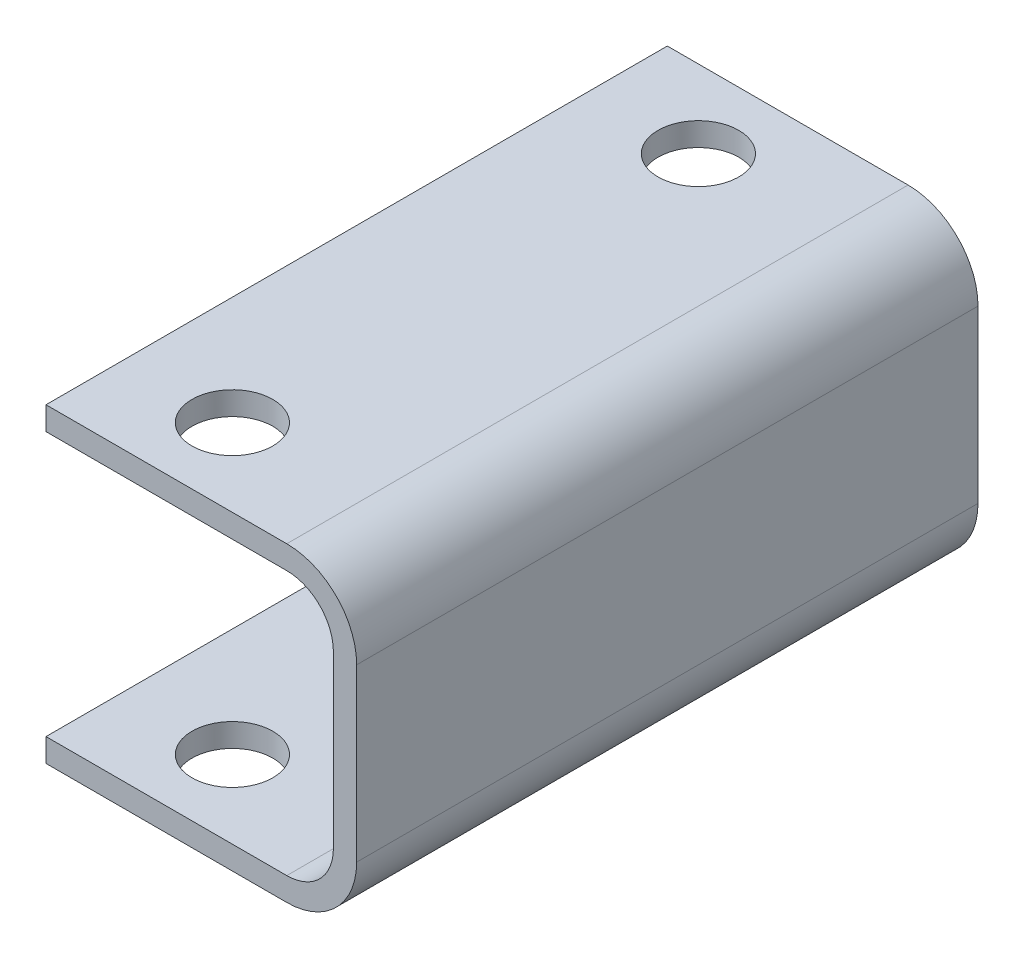
ISO-10303-21;
HEADER;
FILE_DESCRIPTION(('STEP AP214'),'2;1');
FILE_NAME('part.step','',(''),(''),'','','');
FILE_SCHEMA(('AUTOMOTIVE_DESIGN { 1 0 10303 214 1 1 1 1 }'));
ENDSEC;
DATA;
#1=APPLICATION_CONTEXT('core data for automotive mechanical design processes');
#2=APPLICATION_PROTOCOL_DEFINITION('international standard','automotive_design',2000,#1);
#3=PRODUCT_CONTEXT('',#1,'mechanical');
#4=PRODUCT('Part','Part','',(#3));
#5=PRODUCT_RELATED_PRODUCT_CATEGORY('part','',(#4));
#6=PRODUCT_DEFINITION_FORMATION('','',#4);
#7=PRODUCT_DEFINITION_CONTEXT('part definition',#1,'design');
#8=PRODUCT_DEFINITION('design','',#6,#7);
#9=PRODUCT_DEFINITION_SHAPE('','',#8);
#10=(LENGTH_UNIT() NAMED_UNIT(*) SI_UNIT(.MILLI.,.METRE.));
#11=(NAMED_UNIT(*) PLANE_ANGLE_UNIT() SI_UNIT($,.RADIAN.));
#12=(NAMED_UNIT(*) SI_UNIT($,.STERADIAN.) SOLID_ANGLE_UNIT());
#13=UNCERTAINTY_MEASURE_WITH_UNIT(LENGTH_MEASURE(1.E-05),#10,'distance_accuracy_value','');
#14=(GEOMETRIC_REPRESENTATION_CONTEXT(3) GLOBAL_UNCERTAINTY_ASSIGNED_CONTEXT((#13)) GLOBAL_UNIT_ASSIGNED_CONTEXT((#10,
#11,#12)) REPRESENTATION_CONTEXT('',''));
#15=CARTESIAN_POINT('',(0.,0.,0.));
#16=DIRECTION('',(0.,0.,1.));
#17=DIRECTION('',(1.,0.,0.));
#18=AXIS2_PLACEMENT_3D('',#15,#16,#17);
#19=CARTESIAN_POINT('',(0.925677431688005,5.5,40.));
#20=DIRECTION('',(0.,0.,-1.));
#21=DIRECTION('',(-1.,0.,0.));
#22=AXIS2_PLACEMENT_3D('',#19,#20,#21);
#23=CYLINDRICAL_SURFACE('',#22,3.);
#24=CARTESIAN_POINT('',(0.925677431688005,5.5,0.));
#25=DIRECTION('',(0.,0.,-1.));
#26=DIRECTION('',(-1.,0.,0.));
#27=AXIS2_PLACEMENT_3D('',#24,#25,#26);
#28=CIRCLE('',#27,3.);
#29=CARTESIAN_POINT('',(0.925677431687984,8.5,0.));
#30=VERTEX_POINT('',#29);
#31=CARTESIAN_POINT('',(3.92567743168801,5.49999999999998,0.));
#32=VERTEX_POINT('',#31);
#33=EDGE_CURVE('E167',#30,#32,#28,.T.);
#34=ORIENTED_EDGE('',*,*,#33,.T.);
#35=DIRECTION('',(0.,0.,-1.));
#36=VECTOR('',#35,1.);
#37=CARTESIAN_POINT('',(3.92567743168801,5.49999999999998,40.));
#38=LINE('',#37,#36);
#39=CARTESIAN_POINT('',(3.92567743168801,5.49999999999998,40.));
#40=VERTEX_POINT('',#39);
#41=EDGE_CURVE('E11',#40,#32,#38,.T.);
#42=ORIENTED_EDGE('',*,*,#41,.F.);
#43=CARTESIAN_POINT('',(0.925677431688005,5.5,40.));
#44=DIRECTION('',(0.,0.,-1.));
#45=DIRECTION('',(-1.,0.,0.));
#46=AXIS2_PLACEMENT_3D('',#43,#44,#45);
#47=CIRCLE('',#46,3.);
#48=CARTESIAN_POINT('',(0.925677431687984,8.5,40.));
#49=VERTEX_POINT('',#48);
#50=EDGE_CURVE('E190',#49,#40,#47,.T.);
#51=ORIENTED_EDGE('',*,*,#50,.F.);
#52=DIRECTION('',(0.,0.,-1.));
#53=VECTOR('',#52,1.);
#54=CARTESIAN_POINT('',(0.925677431687984,8.5,40.));
#55=LINE('',#54,#53);
#56=EDGE_CURVE('E163',#49,#30,#55,.T.);
#57=ORIENTED_EDGE('',*,*,#56,.T.);
#58=EDGE_LOOP('',(#34,#42,#51,#57));
#59=FACE_BOUND('',#58,.T.);
#60=ADVANCED_FACE('F45',(#59),#23,.F.);
#61=CARTESIAN_POINT('',(3.92567743168801,-5.49999999999998,40.));
#62=DIRECTION('',(1.,0.,0.));
#63=DIRECTION('',(0.,0.,-1.));
#64=AXIS2_PLACEMENT_3D('',#61,#62,#63);
#65=PLANE('',#64);
#66=DIRECTION('',(0.,-1.,0.));
#67=VECTOR('',#66,1.);
#68=CARTESIAN_POINT('',(3.92567743168801,-5.49999999999998,0.));
#69=LINE('',#68,#67);
#70=CARTESIAN_POINT('',(3.92567743168801,-5.49999999999998,0.));
#71=VERTEX_POINT('',#70);
#72=EDGE_CURVE('E170',#32,#71,#69,.T.);
#73=ORIENTED_EDGE('',*,*,#72,.T.);
#74=DIRECTION('',(0.,0.,-1.));
#75=VECTOR('',#74,1.);
#76=CARTESIAN_POINT('',(3.92567743168801,-5.49999999999998,40.));
#77=LINE('',#76,#75);
#78=CARTESIAN_POINT('',(3.92567743168801,-5.49999999999998,40.));
#79=VERTEX_POINT('',#78);
#80=EDGE_CURVE('E54',#79,#71,#77,.T.);
#81=ORIENTED_EDGE('',*,*,#80,.F.);
#82=DIRECTION('',(0.,-1.,0.));
#83=VECTOR('',#82,1.);
#84=CARTESIAN_POINT('',(3.92567743168801,-5.49999999999998,40.));
#85=LINE('',#84,#83);
#86=EDGE_CURVE('E118',#40,#79,#85,.T.);
#87=ORIENTED_EDGE('',*,*,#86,.F.);
#88=ORIENTED_EDGE('',*,*,#41,.T.);
#89=EDGE_LOOP('',(#73,#81,#87,#88));
#90=FACE_BOUND('',#89,.T.);
#91=ADVANCED_FACE('F282',(#90),#65,.F.);
#92=CARTESIAN_POINT('',(0.925677431688005,-5.5,40.));
#93=DIRECTION('',(0.,0.,-1.));
#94=DIRECTION('',(-1.,0.,0.));
#95=AXIS2_PLACEMENT_3D('',#92,#93,#94);
#96=CYLINDRICAL_SURFACE('',#95,3.);
#97=CARTESIAN_POINT('',(0.925677431688005,-5.5,0.));
#98=DIRECTION('',(0.,0.,-1.));
#99=DIRECTION('',(1.,0.,0.));
#100=AXIS2_PLACEMENT_3D('',#97,#98,#99);
#101=CIRCLE('',#100,3.);
#102=CARTESIAN_POINT('',(0.925677431687984,-8.5,0.));
#103=VERTEX_POINT('',#102);
#104=EDGE_CURVE('E173',#71,#103,#101,.T.);
#105=ORIENTED_EDGE('',*,*,#104,.T.);
#106=DIRECTION('',(0.,0.,-1.));
#107=VECTOR('',#106,1.);
#108=CARTESIAN_POINT('',(0.925677431687984,-8.5,40.));
#109=LINE('',#108,#107);
#110=CARTESIAN_POINT('',(0.925677431687984,-8.5,40.));
#111=VERTEX_POINT('',#110);
#112=EDGE_CURVE('E209',#111,#103,#109,.T.);
#113=ORIENTED_EDGE('',*,*,#112,.F.);
#114=CARTESIAN_POINT('',(0.925677431688005,-5.5,40.));
#115=DIRECTION('',(0.,0.,-1.));
#116=DIRECTION('',(1.,0.,0.));
#117=AXIS2_PLACEMENT_3D('',#114,#115,#116);
#118=CIRCLE('',#117,3.);
#119=EDGE_CURVE('E239',#79,#111,#118,.T.);
#120=ORIENTED_EDGE('',*,*,#119,.F.);
#121=ORIENTED_EDGE('',*,*,#80,.T.);
#122=EDGE_LOOP('',(#105,#113,#120,#121));
#123=FACE_BOUND('',#122,.T.);
#124=ADVANCED_FACE('F286',(#123),#96,.F.);
#125=CARTESIAN_POINT('',(-14.574322568312,-8.5,40.));
#126=DIRECTION('',(0.,-1.,0.));
#127=DIRECTION('',(1.,0.,0.));
#128=AXIS2_PLACEMENT_3D('',#125,#126,#127);
#129=PLANE('',#128);
#130=CARTESIAN_POINT('',(-7.574322568312,-8.5,35.));
#131=DIRECTION('',(0.,-1.,0.));
#132=DIRECTION('',(1.,0.,0.));
#133=AXIS2_PLACEMENT_3D('',#130,#131,#132);
#134=CIRCLE('',#133,2.59999999999999);
#135=CARTESIAN_POINT('',(-4.974322568312,-8.5,35.));
#136=VERTEX_POINT('',#135);
#137=EDGE_CURVE('E171',#136,#136,#134,.T.);
#138=ORIENTED_EDGE('',*,*,#137,.T.);
#139=EDGE_LOOP('',(#138));
#140=FACE_BOUND('',#139,.T.);
#141=CARTESIAN_POINT('',(-7.57432256831199,-8.5,5.));
#142=DIRECTION('',(0.,-1.,0.));
#143=DIRECTION('',(1.,0.,0.));
#144=AXIS2_PLACEMENT_3D('',#141,#142,#143);
#145=CIRCLE('',#144,2.6);
#146=CARTESIAN_POINT('',(-4.97432256831199,-8.5,5.));
#147=VERTEX_POINT('',#146);
#148=EDGE_CURVE('E215',#147,#147,#145,.T.);
#149=ORIENTED_EDGE('',*,*,#148,.T.);
#150=EDGE_LOOP('',(#149));
#151=FACE_BOUND('',#150,.T.);
#152=DIRECTION('',(-1.,0.,0.));
#153=VECTOR('',#152,1.);
#154=CARTESIAN_POINT('',(-14.574322568312,-8.5,0.));
#155=LINE('',#154,#153);
#156=CARTESIAN_POINT('',(-14.574322568312,-8.5,0.));
#157=VERTEX_POINT('',#156);
#158=EDGE_CURVE('E175',#103,#157,#155,.T.);
#159=ORIENTED_EDGE('',*,*,#158,.T.);
#160=DIRECTION('',(0.,0.,-1.));
#161=VECTOR('',#160,1.);
#162=CARTESIAN_POINT('',(-14.574322568312,-8.5,40.));
#163=LINE('',#162,#161);
#164=CARTESIAN_POINT('',(-14.574322568312,-8.5,40.));
#165=VERTEX_POINT('',#164);
#166=EDGE_CURVE('E206',#165,#157,#163,.T.);
#167=ORIENTED_EDGE('',*,*,#166,.F.);
#168=DIRECTION('',(-1.,0.,0.));
#169=VECTOR('',#168,1.);
#170=CARTESIAN_POINT('',(-14.574322568312,-8.5,40.));
#171=LINE('',#170,#169);
#172=EDGE_CURVE('E241',#111,#165,#171,.T.);
#173=ORIENTED_EDGE('',*,*,#172,.F.);
#174=ORIENTED_EDGE('',*,*,#112,.T.);
#175=EDGE_LOOP('',(#159,#167,#173,#174));
#176=FACE_BOUND('',#175,.T.);
#177=ADVANCED_FACE('F290',(#140,#151,#176),#129,.F.);
#178=CARTESIAN_POINT('',(-14.574322568312,-10.,40.));
#179=DIRECTION('',(1.,0.,0.));
#180=DIRECTION('',(0.,1.,0.));
#181=AXIS2_PLACEMENT_3D('',#178,#179,#180);
#182=PLANE('',#181);
#183=DIRECTION('',(0.,-1.,0.));
#184=VECTOR('',#183,1.);
#185=CARTESIAN_POINT('',(-14.574322568312,-10.,0.));
#186=LINE('',#185,#184);
#187=CARTESIAN_POINT('',(-14.574322568312,-10.,0.));
#188=VERTEX_POINT('',#187);
#189=EDGE_CURVE('E177',#157,#188,#186,.T.);
#190=ORIENTED_EDGE('',*,*,#189,.T.);
#191=DIRECTION('',(0.,0.,-1.));
#192=VECTOR('',#191,1.);
#193=CARTESIAN_POINT('',(-14.574322568312,-10.,40.));
#194=LINE('',#193,#192);
#195=CARTESIAN_POINT('',(-14.574322568312,-10.,40.));
#196=VERTEX_POINT('',#195);
#197=EDGE_CURVE('E203',#196,#188,#194,.T.);
#198=ORIENTED_EDGE('',*,*,#197,.F.);
#199=DIRECTION('',(0.,-1.,0.));
#200=VECTOR('',#199,1.);
#201=CARTESIAN_POINT('',(-14.574322568312,-10.,40.));
#202=LINE('',#201,#200);
#203=EDGE_CURVE('E243',#165,#196,#202,.T.);
#204=ORIENTED_EDGE('',*,*,#203,.F.);
#205=ORIENTED_EDGE('',*,*,#166,.T.);
#206=EDGE_LOOP('',(#190,#198,#204,#205));
#207=FACE_BOUND('',#206,.T.);
#208=ADVANCED_FACE('F296',(#207),#182,.F.);
#209=CARTESIAN_POINT('',(0.925677431687973,-10.,40.));
#210=DIRECTION('',(0.,1.,0.));
#211=DIRECTION('',(0.,0.,1.));
#212=AXIS2_PLACEMENT_3D('',#209,#210,#211);
#213=PLANE('',#212);
#214=CARTESIAN_POINT('',(-7.574322568312,-10.,35.));
#215=DIRECTION('',(0.,-1.,0.));
#216=DIRECTION('',(0.,0.,-1.));
#217=AXIS2_PLACEMENT_3D('',#214,#215,#216);
#218=CIRCLE('',#217,2.59999999999999);
#219=CARTESIAN_POINT('',(-7.574322568312,-10.,32.4));
#220=VERTEX_POINT('',#219);
#221=EDGE_CURVE('E222',#220,#220,#218,.T.);
#222=ORIENTED_EDGE('',*,*,#221,.F.);
#223=EDGE_LOOP('',(#222));
#224=FACE_BOUND('',#223,.T.);
#225=CARTESIAN_POINT('',(-7.57432256831199,-10.,5.));
#226=DIRECTION('',(0.,-1.,0.));
#227=DIRECTION('',(0.,0.,-1.));
#228=AXIS2_PLACEMENT_3D('',#225,#226,#227);
#229=CIRCLE('',#228,2.6);
#230=CARTESIAN_POINT('',(-7.57432256831199,-10.,2.4));
#231=VERTEX_POINT('',#230);
#232=EDGE_CURVE('E227',#231,#231,#229,.T.);
#233=ORIENTED_EDGE('',*,*,#232,.F.);
#234=EDGE_LOOP('',(#233));
#235=FACE_BOUND('',#234,.T.);
#236=DIRECTION('',(1.,0.,0.));
#237=VECTOR('',#236,1.);
#238=CARTESIAN_POINT('',(0.925677431687973,-10.,0.));
#239=LINE('',#238,#237);
#240=CARTESIAN_POINT('',(0.925677431687973,-10.,0.));
#241=VERTEX_POINT('',#240);
#242=EDGE_CURVE('E179',#188,#241,#239,.T.);
#243=ORIENTED_EDGE('',*,*,#242,.T.);
#244=DIRECTION('',(0.,0.,-1.));
#245=VECTOR('',#244,1.);
#246=CARTESIAN_POINT('',(0.925677431687973,-10.,40.));
#247=LINE('',#246,#245);
#248=CARTESIAN_POINT('',(0.925677431687973,-10.,40.));
#249=VERTEX_POINT('',#248);
#250=EDGE_CURVE('E200',#249,#241,#247,.T.);
#251=ORIENTED_EDGE('',*,*,#250,.F.);
#252=DIRECTION('',(1.,0.,0.));
#253=VECTOR('',#252,1.);
#254=CARTESIAN_POINT('',(0.925677431687973,-10.,40.));
#255=LINE('',#254,#253);
#256=EDGE_CURVE('E245',#196,#249,#255,.T.);
#257=ORIENTED_EDGE('',*,*,#256,.F.);
#258=ORIENTED_EDGE('',*,*,#197,.T.);
#259=EDGE_LOOP('',(#243,#251,#257,#258));
#260=FACE_BOUND('',#259,.T.);
#261=ADVANCED_FACE('F300',(#224,#235,#260),#213,.F.);
#262=CARTESIAN_POINT('',(0.925677431688006,-5.5,40.));
#263=DIRECTION('',(0.,0.,-1.));
#264=DIRECTION('',(-1.,0.,0.));
#265=AXIS2_PLACEMENT_3D('',#262,#263,#264);
#266=CYLINDRICAL_SURFACE('',#265,4.5);
#267=CARTESIAN_POINT('',(0.925677431688006,-5.5,0.));
#268=DIRECTION('',(0.,0.,1.));
#269=DIRECTION('',(-1.,0.,0.));
#270=AXIS2_PLACEMENT_3D('',#267,#268,#269);
#271=CIRCLE('',#270,4.5);
#272=CARTESIAN_POINT('',(5.425677431688,-5.49999999999997,0.));
#273=VERTEX_POINT('',#272);
#274=EDGE_CURVE('E181',#241,#273,#271,.T.);
#275=ORIENTED_EDGE('',*,*,#274,.T.);
#276=DIRECTION('',(0.,0.,-1.));
#277=VECTOR('',#276,1.);
#278=CARTESIAN_POINT('',(5.425677431688,-5.49999999999997,40.));
#279=LINE('',#278,#277);
#280=CARTESIAN_POINT('',(5.425677431688,-5.49999999999997,40.));
#281=VERTEX_POINT('',#280);
#282=EDGE_CURVE('E197',#281,#273,#279,.T.);
#283=ORIENTED_EDGE('',*,*,#282,.F.);
#284=CARTESIAN_POINT('',(0.925677431688006,-5.5,40.));
#285=DIRECTION('',(0.,0.,1.));
#286=DIRECTION('',(-1.,0.,0.));
#287=AXIS2_PLACEMENT_3D('',#284,#285,#286);
#288=CIRCLE('',#287,4.5);
#289=EDGE_CURVE('E247',#249,#281,#288,.T.);
#290=ORIENTED_EDGE('',*,*,#289,.F.);
#291=ORIENTED_EDGE('',*,*,#250,.T.);
#292=EDGE_LOOP('',(#275,#283,#290,#291));
#293=FACE_BOUND('',#292,.T.);
#294=ADVANCED_FACE('F304',(#293),#266,.T.);
#295=CARTESIAN_POINT('',(5.425677431688,5.49999999999997,40.));
#296=DIRECTION('',(-1.,0.,0.));
#297=DIRECTION('',(0.,0.,1.));
#298=AXIS2_PLACEMENT_3D('',#295,#296,#297);
#299=PLANE('',#298);
#300=DIRECTION('',(0.,1.,0.));
#301=VECTOR('',#300,1.);
#302=CARTESIAN_POINT('',(5.425677431688,5.49999999999997,0.));
#303=LINE('',#302,#301);
#304=CARTESIAN_POINT('',(5.425677431688,5.49999999999997,0.));
#305=VERTEX_POINT('',#304);
#306=EDGE_CURVE('E183',#273,#305,#303,.T.);
#307=ORIENTED_EDGE('',*,*,#306,.T.);
#308=DIRECTION('',(0.,0.,-1.));
#309=VECTOR('',#308,1.);
#310=CARTESIAN_POINT('',(5.425677431688,5.49999999999997,40.));
#311=LINE('',#310,#309);
#312=CARTESIAN_POINT('',(5.425677431688,5.49999999999997,40.));
#313=VERTEX_POINT('',#312);
#314=EDGE_CURVE('E194',#313,#305,#311,.T.);
#315=ORIENTED_EDGE('',*,*,#314,.F.);
#316=DIRECTION('',(0.,1.,0.));
#317=VECTOR('',#316,1.);
#318=CARTESIAN_POINT('',(5.425677431688,5.49999999999997,40.));
#319=LINE('',#318,#317);
#320=EDGE_CURVE('E249',#281,#313,#319,.T.);
#321=ORIENTED_EDGE('',*,*,#320,.F.);
#322=ORIENTED_EDGE('',*,*,#282,.T.);
#323=EDGE_LOOP('',(#307,#315,#321,#322));
#324=FACE_BOUND('',#323,.T.);
#325=ADVANCED_FACE('F255',(#324),#299,.F.);
#326=CARTESIAN_POINT('',(0.925677431688005,5.5,40.));
#327=DIRECTION('',(0.,0.,-1.));
#328=DIRECTION('',(-1.,0.,0.));
#329=AXIS2_PLACEMENT_3D('',#326,#327,#328);
#330=CYLINDRICAL_SURFACE('',#329,4.5);
#331=CARTESIAN_POINT('',(0.925677431688005,5.5,0.));
#332=DIRECTION('',(0.,0.,1.));
#333=DIRECTION('',(1.,0.,0.));
#334=AXIS2_PLACEMENT_3D('',#331,#332,#333);
#335=CIRCLE('',#334,4.5);
#336=CARTESIAN_POINT('',(0.925677431687974,10.,0.));
#337=VERTEX_POINT('',#336);
#338=EDGE_CURVE('E185',#305,#337,#335,.T.);
#339=ORIENTED_EDGE('',*,*,#338,.T.);
#340=DIRECTION('',(0.,0.,-1.));
#341=VECTOR('',#340,1.);
#342=CARTESIAN_POINT('',(0.925677431687974,10.,40.));
#343=LINE('',#342,#341);
#344=CARTESIAN_POINT('',(0.925677431687974,10.,40.));
#345=VERTEX_POINT('',#344);
#346=EDGE_CURVE('E158',#345,#337,#343,.T.);
#347=ORIENTED_EDGE('',*,*,#346,.F.);
#348=CARTESIAN_POINT('',(0.925677431688005,5.5,40.));
#349=DIRECTION('',(0.,0.,1.));
#350=DIRECTION('',(1.,0.,0.));
#351=AXIS2_PLACEMENT_3D('',#348,#349,#350);
#352=CIRCLE('',#351,4.5);
#353=EDGE_CURVE('E149',#313,#345,#352,.T.);
#354=ORIENTED_EDGE('',*,*,#353,.F.);
#355=ORIENTED_EDGE('',*,*,#314,.T.);
#356=EDGE_LOOP('',(#339,#347,#354,#355));
#357=FACE_BOUND('',#356,.T.);
#358=ADVANCED_FACE('F259',(#357),#330,.T.);
#359=CARTESIAN_POINT('',(0.925677431687973,10.,40.));
#360=DIRECTION('',(0.,-1.,0.));
#361=DIRECTION('',(0.,0.,-1.));
#362=AXIS2_PLACEMENT_3D('',#359,#360,#361);
#363=PLANE('',#362);
#364=CARTESIAN_POINT('',(-7.574322568312,10.,35.));
#365=DIRECTION('',(0.,-1.,0.));
#366=DIRECTION('',(0.,0.,-1.));
#367=AXIS2_PLACEMENT_3D('',#364,#365,#366);
#368=CIRCLE('',#367,2.59999999999999);
#369=CARTESIAN_POINT('',(-7.574322568312,10.,32.4));
#370=VERTEX_POINT('',#369);
#371=EDGE_CURVE('E216',#370,#370,#368,.F.);
#372=ORIENTED_EDGE('',*,*,#371,.F.);
#373=EDGE_LOOP('',(#372));
#374=FACE_BOUND('',#373,.T.);
#375=CARTESIAN_POINT('',(-7.57432256831199,10.,5.));
#376=DIRECTION('',(0.,-1.,0.));
#377=DIRECTION('',(0.,0.,-1.));
#378=AXIS2_PLACEMENT_3D('',#375,#376,#377);
#379=CIRCLE('',#378,2.6);
#380=CARTESIAN_POINT('',(-7.57432256831199,10.,2.4));
#381=VERTEX_POINT('',#380);
#382=EDGE_CURVE('E230',#381,#381,#379,.F.);
#383=ORIENTED_EDGE('',*,*,#382,.F.);
#384=EDGE_LOOP('',(#383));
#385=FACE_BOUND('',#384,.T.);
#386=DIRECTION('',(-1.,0.,0.));
#387=VECTOR('',#386,1.);
#388=CARTESIAN_POINT('',(0.925677431687973,10.,0.));
#389=LINE('',#388,#387);
#390=CARTESIAN_POINT('',(-14.574322568312,10.,0.));
#391=VERTEX_POINT('',#390);
#392=EDGE_CURVE('E157',#337,#391,#389,.T.);
#393=ORIENTED_EDGE('',*,*,#392,.T.);
#394=DIRECTION('',(0.,0.,-1.));
#395=VECTOR('',#394,1.);
#396=CARTESIAN_POINT('',(-14.574322568312,10.,40.));
#397=LINE('',#396,#395);
#398=CARTESIAN_POINT('',(-14.574322568312,10.,40.));
#399=VERTEX_POINT('',#398);
#400=EDGE_CURVE('E154',#399,#391,#397,.T.);
#401=ORIENTED_EDGE('',*,*,#400,.F.);
#402=DIRECTION('',(-1.,0.,0.));
#403=VECTOR('',#402,1.);
#404=CARTESIAN_POINT('',(0.925677431687973,10.,40.));
#405=LINE('',#404,#403);
#406=EDGE_CURVE('E143',#345,#399,#405,.T.);
#407=ORIENTED_EDGE('',*,*,#406,.F.);
#408=ORIENTED_EDGE('',*,*,#346,.T.);
#409=EDGE_LOOP('',(#393,#401,#407,#408));
#410=FACE_BOUND('',#409,.T.);
#411=ADVANCED_FACE('F155',(#374,#385,#410),#363,.F.);
#412=CARTESIAN_POINT('',(-14.574322568312,10.,40.));
#413=DIRECTION('',(1.,0.,0.));
#414=DIRECTION('',(0.,1.,0.));
#415=AXIS2_PLACEMENT_3D('',#412,#413,#414);
#416=PLANE('',#415);
#417=DIRECTION('',(0.,-1.,0.));
#418=VECTOR('',#417,1.);
#419=CARTESIAN_POINT('',(-14.574322568312,10.,0.));
#420=LINE('',#419,#418);
#421=CARTESIAN_POINT('',(-14.574322568312,8.5,0.));
#422=VERTEX_POINT('',#421);
#423=EDGE_CURVE('E104',#391,#422,#420,.T.);
#424=ORIENTED_EDGE('',*,*,#423,.T.);
#425=DIRECTION('',(0.,0.,-1.));
#426=VECTOR('',#425,1.);
#427=CARTESIAN_POINT('',(-14.574322568312,8.5,40.));
#428=LINE('',#427,#426);
#429=CARTESIAN_POINT('',(-14.574322568312,8.5,40.));
#430=VERTEX_POINT('',#429);
#431=EDGE_CURVE('E159',#430,#422,#428,.T.);
#432=ORIENTED_EDGE('',*,*,#431,.F.);
#433=DIRECTION('',(0.,-1.,0.));
#434=VECTOR('',#433,1.);
#435=CARTESIAN_POINT('',(-14.574322568312,10.,40.));
#436=LINE('',#435,#434);
#437=EDGE_CURVE('E147',#399,#430,#436,.T.);
#438=ORIENTED_EDGE('',*,*,#437,.F.);
#439=ORIENTED_EDGE('',*,*,#400,.T.);
#440=EDGE_LOOP('',(#424,#432,#438,#439));
#441=FACE_BOUND('',#440,.T.);
#442=ADVANCED_FACE('F161',(#441),#416,.F.);
#443=CARTESIAN_POINT('',(-14.574322568312,8.5,40.));
#444=DIRECTION('',(0.,1.,0.));
#445=DIRECTION('',(-1.,0.,0.));
#446=AXIS2_PLACEMENT_3D('',#443,#444,#445);
#447=PLANE('',#446);
#448=CARTESIAN_POINT('',(-7.574322568312,8.5,35.));
#449=DIRECTION('',(0.,1.,0.));
#450=DIRECTION('',(-1.,0.,0.));
#451=AXIS2_PLACEMENT_3D('',#448,#449,#450);
#452=CIRCLE('',#451,2.59999999999999);
#453=CARTESIAN_POINT('',(-10.174322568312,8.5,35.));
#454=VERTEX_POINT('',#453);
#455=EDGE_CURVE('E48',#454,#454,#452,.T.);
#456=ORIENTED_EDGE('',*,*,#455,.T.);
#457=EDGE_LOOP('',(#456));
#458=FACE_BOUND('',#457,.T.);
#459=CARTESIAN_POINT('',(-7.57432256831199,8.5,5.));
#460=DIRECTION('',(0.,1.,0.));
#461=DIRECTION('',(-1.,0.,0.));
#462=AXIS2_PLACEMENT_3D('',#459,#460,#461);
#463=CIRCLE('',#462,2.6);
#464=CARTESIAN_POINT('',(-10.174322568312,8.5,5.));
#465=VERTEX_POINT('',#464);
#466=EDGE_CURVE('E213',#465,#465,#463,.T.);
#467=ORIENTED_EDGE('',*,*,#466,.T.);
#468=EDGE_LOOP('',(#467));
#469=FACE_BOUND('',#468,.T.);
#470=DIRECTION('',(1.,0.,0.));
#471=VECTOR('',#470,1.);
#472=CARTESIAN_POINT('',(-14.574322568312,8.5,0.));
#473=LINE('',#472,#471);
#474=EDGE_CURVE('E110',#422,#30,#473,.T.);
#475=ORIENTED_EDGE('',*,*,#474,.T.);
#476=ORIENTED_EDGE('',*,*,#56,.F.);
#477=DIRECTION('',(1.,0.,0.));
#478=VECTOR('',#477,1.);
#479=CARTESIAN_POINT('',(-14.574322568312,8.5,40.));
#480=LINE('',#479,#478);
#481=EDGE_CURVE('E63',#430,#49,#480,.T.);
#482=ORIENTED_EDGE('',*,*,#481,.F.);
#483=ORIENTED_EDGE('',*,*,#431,.T.);
#484=EDGE_LOOP('',(#475,#476,#482,#483));
#485=FACE_BOUND('',#484,.T.);
#486=ADVANCED_FACE('F267',(#458,#469,#485),#447,.F.);
#487=CARTESIAN_POINT('',(0.925677431688005,5.5,40.));
#488=DIRECTION('',(0.,0.,-1.));
#489=DIRECTION('',(-1.,0.,0.));
#490=AXIS2_PLACEMENT_3D('',#487,#488,#489);
#491=PLANE('',#490);
#492=ORIENTED_EDGE('',*,*,#50,.T.);
#493=ORIENTED_EDGE('',*,*,#86,.T.);
#494=ORIENTED_EDGE('',*,*,#119,.T.);
#495=ORIENTED_EDGE('',*,*,#172,.T.);
#496=ORIENTED_EDGE('',*,*,#203,.T.);
#497=ORIENTED_EDGE('',*,*,#256,.T.);
#498=ORIENTED_EDGE('',*,*,#289,.T.);
#499=ORIENTED_EDGE('',*,*,#320,.T.);
#500=ORIENTED_EDGE('',*,*,#353,.T.);
#501=ORIENTED_EDGE('',*,*,#406,.T.);
#502=ORIENTED_EDGE('',*,*,#437,.T.);
#503=ORIENTED_EDGE('',*,*,#481,.T.);
#504=EDGE_LOOP('',(#492,#493,#494,#495,#496,#497,#498,#499,#500,#501,#502,#503));
#505=FACE_BOUND('',#504,.T.);
#506=ADVANCED_FACE('F145',(#505),#491,.F.);
#507=CARTESIAN_POINT('',(0.925677431688005,5.5,0.));
#508=DIRECTION('',(0.,0.,-1.));
#509=DIRECTION('',(-1.,0.,0.));
#510=AXIS2_PLACEMENT_3D('',#507,#508,#509);
#511=PLANE('',#510);
#512=ORIENTED_EDGE('',*,*,#33,.F.);
#513=ORIENTED_EDGE('',*,*,#474,.F.);
#514=ORIENTED_EDGE('',*,*,#423,.F.);
#515=ORIENTED_EDGE('',*,*,#392,.F.);
#516=ORIENTED_EDGE('',*,*,#338,.F.);
#517=ORIENTED_EDGE('',*,*,#306,.F.);
#518=ORIENTED_EDGE('',*,*,#274,.F.);
#519=ORIENTED_EDGE('',*,*,#242,.F.);
#520=ORIENTED_EDGE('',*,*,#189,.F.);
#521=ORIENTED_EDGE('',*,*,#158,.F.);
#522=ORIENTED_EDGE('',*,*,#104,.F.);
#523=ORIENTED_EDGE('',*,*,#72,.F.);
#524=EDGE_LOOP('',(#512,#513,#514,#515,#516,#517,#518,#519,#520,#521,#522,#523));
#525=FACE_BOUND('',#524,.T.);
#526=ADVANCED_FACE('F262',(#525),#511,.T.);
#527=CARTESIAN_POINT('',(-7.57432256831199,17.3539105243401,5.));
#528=DIRECTION('',(0.,-1.,0.));
#529=DIRECTION('',(0.,0.,-1.));
#530=AXIS2_PLACEMENT_3D('',#527,#528,#529);
#531=CYLINDRICAL_SURFACE('',#530,2.6);
#532=ORIENTED_EDGE('',*,*,#382,.T.);
#533=EDGE_LOOP('',(#532));
#534=FACE_BOUND('',#533,.T.);
#535=ORIENTED_EDGE('',*,*,#466,.F.);
#536=EDGE_LOOP('',(#535));
#537=FACE_BOUND('',#536,.T.);
#538=ADVANCED_FACE('F319',(#534,#537),#531,.F.);
#539=CARTESIAN_POINT('',(-7.574322568312,17.3539105243401,35.));
#540=DIRECTION('',(0.,-1.,0.));
#541=DIRECTION('',(0.,0.,-1.));
#542=AXIS2_PLACEMENT_3D('',#539,#540,#541);
#543=CYLINDRICAL_SURFACE('',#542,2.59999999999999);
#544=ORIENTED_EDGE('',*,*,#371,.T.);
#545=EDGE_LOOP('',(#544));
#546=FACE_BOUND('',#545,.T.);
#547=ORIENTED_EDGE('',*,*,#455,.F.);
#548=EDGE_LOOP('',(#547));
#549=FACE_BOUND('',#548,.T.);
#550=ADVANCED_FACE('F321',(#546,#549),#543,.F.);
#551=ORIENTED_EDGE('',*,*,#232,.T.);
#552=EDGE_LOOP('',(#551));
#553=FACE_BOUND('',#552,.T.);
#554=ORIENTED_EDGE('',*,*,#148,.F.);
#555=EDGE_LOOP('',(#554));
#556=FACE_BOUND('',#555,.T.);
#557=ADVANCED_FACE('F323',(#553,#556),#531,.F.);
#558=ORIENTED_EDGE('',*,*,#221,.T.);
#559=EDGE_LOOP('',(#558));
#560=FACE_BOUND('',#559,.T.);
#561=ORIENTED_EDGE('',*,*,#137,.F.);
#562=EDGE_LOOP('',(#561));
#563=FACE_BOUND('',#562,.T.);
#564=ADVANCED_FACE('F328',(#560,#563),#543,.F.);
#565=CLOSED_SHELL('',(#60,#91,#124,#177,#208,#261,#294,#325,#358,#411,#442,#486,#506,#526,#538,
#550,#557,#564));
#566=MANIFOLD_SOLID_BREP('B2',#565);
#567=ADVANCED_BREP_SHAPE_REPRESENTATION('',(#18,#566),#14);
#568=SHAPE_DEFINITION_REPRESENTATION(#9,#567);
ENDSEC;
END-ISO-10303-21;
